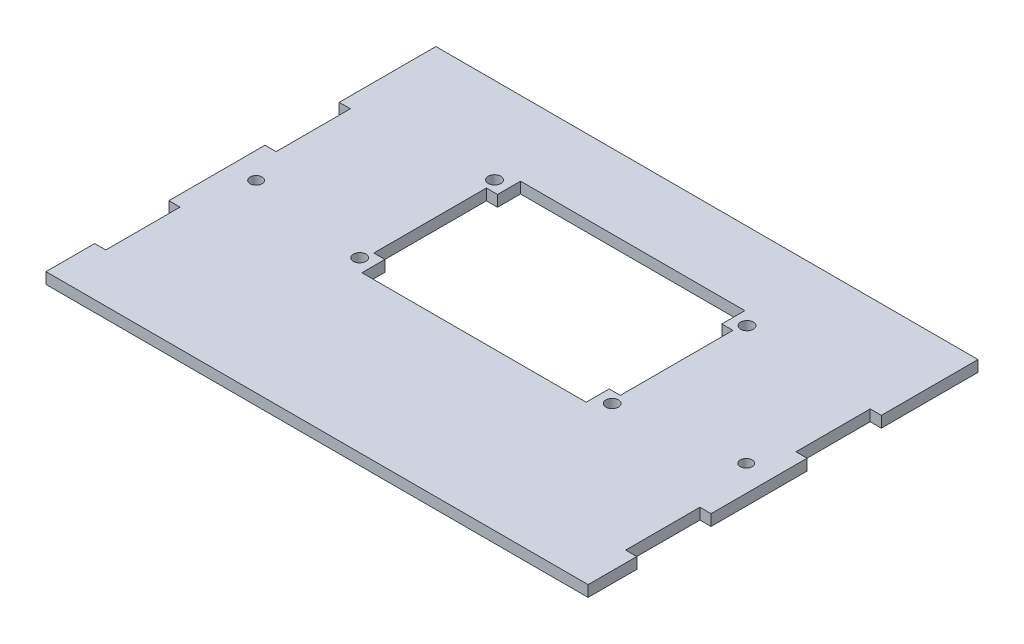
ISO-10303-21;
HEADER;
FILE_DESCRIPTION(('STEP AP214'),'2;1');
FILE_NAME('part.step','',(''),(''),'','','');
FILE_SCHEMA(('AUTOMOTIVE_DESIGN { 1 0 10303 214 1 1 1 1 }'));
ENDSEC;
DATA;
#1=APPLICATION_CONTEXT('core data for automotive mechanical design processes');
#2=APPLICATION_PROTOCOL_DEFINITION('international standard','automotive_design',2000,#1);
#3=PRODUCT_CONTEXT('',#1,'mechanical');
#4=PRODUCT('Part','Part','',(#3));
#5=PRODUCT_RELATED_PRODUCT_CATEGORY('part','',(#4));
#6=PRODUCT_DEFINITION_FORMATION('','',#4);
#7=PRODUCT_DEFINITION_CONTEXT('part definition',#1,'design');
#8=PRODUCT_DEFINITION('design','',#6,#7);
#9=PRODUCT_DEFINITION_SHAPE('','',#8);
#10=(LENGTH_UNIT() NAMED_UNIT(*) SI_UNIT(.MILLI.,.METRE.));
#11=(NAMED_UNIT(*) PLANE_ANGLE_UNIT() SI_UNIT($,.RADIAN.));
#12=(NAMED_UNIT(*) SI_UNIT($,.STERADIAN.) SOLID_ANGLE_UNIT());
#13=UNCERTAINTY_MEASURE_WITH_UNIT(LENGTH_MEASURE(1.E-05),#10,'distance_accuracy_value','');
#14=(GEOMETRIC_REPRESENTATION_CONTEXT(3) GLOBAL_UNCERTAINTY_ASSIGNED_CONTEXT((#13)) GLOBAL_UNIT_ASSIGNED_CONTEXT((#10,
#11,#12)) REPRESENTATION_CONTEXT('',''));
#15=CARTESIAN_POINT('',(0.,0.,0.));
#16=DIRECTION('',(0.,0.,1.));
#17=DIRECTION('',(1.,0.,0.));
#18=AXIS2_PLACEMENT_3D('',#15,#16,#17);
#19=CARTESIAN_POINT('',(-30.2,3.,10.22));
#20=DIRECTION('',(-1.,0.,0.));
#21=DIRECTION('',(0.,0.,1.));
#22=AXIS2_PLACEMENT_3D('',#19,#20,#21);
#23=PLANE('',#22);
#24=DIRECTION('',(0.,0.,-1.));
#25=VECTOR('',#24,1.);
#26=CARTESIAN_POINT('',(-30.2,3.,10.22));
#27=LINE('',#26,#25);
#28=CARTESIAN_POINT('',(-30.2,3.,-26.3));
#29=VERTEX_POINT('',#28);
#30=CARTESIAN_POINT('',(-30.2,3.,-32.5));
#31=VERTEX_POINT('',#30);
#32=EDGE_CURVE('E359',#29,#31,#27,.T.);
#33=ORIENTED_EDGE('',*,*,#32,.F.);
#34=DIRECTION('',(0.,-1.,0.));
#35=VECTOR('',#34,1.);
#36=CARTESIAN_POINT('',(-30.2,3.,-26.3));
#37=LINE('',#36,#35);
#38=CARTESIAN_POINT('',(-30.2,0.,-26.3));
#39=VERTEX_POINT('',#38);
#40=EDGE_CURVE('E303',#29,#39,#37,.T.);
#41=ORIENTED_EDGE('',*,*,#40,.T.);
#42=DIRECTION('',(0.,0.,-1.));
#43=VECTOR('',#42,1.);
#44=CARTESIAN_POINT('',(-30.2,0.,10.22));
#45=LINE('',#44,#43);
#46=CARTESIAN_POINT('',(-30.2,0.,-32.5));
#47=VERTEX_POINT('',#46);
#48=EDGE_CURVE('E375',#39,#47,#45,.T.);
#49=ORIENTED_EDGE('',*,*,#48,.T.);
#50=DIRECTION('',(0.,-1.,0.));
#51=VECTOR('',#50,1.);
#52=CARTESIAN_POINT('',(-30.2,3.,-32.5));
#53=LINE('',#52,#51);
#54=EDGE_CURVE('E307',#31,#47,#53,.T.);
#55=ORIENTED_EDGE('',*,*,#54,.F.);
#56=EDGE_LOOP('',(#33,#41,#49,#55));
#57=FACE_BOUND('',#56,.T.);
#58=ADVANCED_FACE('F51',(#57),#23,.F.);
#59=CARTESIAN_POINT('',(30.2,3.,-32.5));
#60=DIRECTION('',(1.,0.,0.));
#61=DIRECTION('',(0.,0.,-1.));
#62=AXIS2_PLACEMENT_3D('',#59,#60,#61);
#63=PLANE('',#62);
#64=DIRECTION('',(0.,0.,1.));
#65=VECTOR('',#64,1.);
#66=CARTESIAN_POINT('',(30.2,3.,-32.5));
#67=LINE('',#66,#65);
#68=CARTESIAN_POINT('',(30.2,3.,4.01999999999999));
#69=VERTEX_POINT('',#68);
#70=CARTESIAN_POINT('',(30.2,3.,10.22));
#71=VERTEX_POINT('',#70);
#72=EDGE_CURVE('E391',#69,#71,#67,.T.);
#73=ORIENTED_EDGE('',*,*,#72,.F.);
#74=DIRECTION('',(0.,-1.,0.));
#75=VECTOR('',#74,1.);
#76=CARTESIAN_POINT('',(30.2,3.,4.01999999999999));
#77=LINE('',#76,#75);
#78=CARTESIAN_POINT('',(30.2,0.,4.01999999999999));
#79=VERTEX_POINT('',#78);
#80=EDGE_CURVE('E322',#69,#79,#77,.T.);
#81=ORIENTED_EDGE('',*,*,#80,.T.);
#82=DIRECTION('',(0.,0.,1.));
#83=VECTOR('',#82,1.);
#84=CARTESIAN_POINT('',(30.2,0.,-32.5));
#85=LINE('',#84,#83);
#86=CARTESIAN_POINT('',(30.2,0.,10.22));
#87=VERTEX_POINT('',#86);
#88=EDGE_CURVE('E379',#79,#87,#85,.T.);
#89=ORIENTED_EDGE('',*,*,#88,.T.);
#90=DIRECTION('',(0.,-1.,0.));
#91=VECTOR('',#90,1.);
#92=CARTESIAN_POINT('',(30.2,3.,10.22));
#93=LINE('',#92,#91);
#94=EDGE_CURVE('E360',#71,#87,#93,.T.);
#95=ORIENTED_EDGE('',*,*,#94,.F.);
#96=EDGE_LOOP('',(#73,#81,#89,#95));
#97=FACE_BOUND('',#96,.T.);
#98=ADVANCED_FACE('F725',(#97),#63,.F.);
#99=CARTESIAN_POINT('',(-73.,3.,52.5));
#100=DIRECTION('',(1.,0.,0.));
#101=DIRECTION('',(0.,0.,-1.));
#102=AXIS2_PLACEMENT_3D('',#99,#100,#101);
#103=PLANE('',#102);
#104=DIRECTION('',(0.,0.,1.));
#105=VECTOR('',#104,1.);
#106=CARTESIAN_POINT('',(-73.,0.,52.5));
#107=LINE('',#106,#105);
#108=CARTESIAN_POINT('',(-73.,0.,-6.46999999999998));
#109=VERTEX_POINT('',#108);
#110=CARTESIAN_POINT('',(-73.,0.,19.4));
#111=VERTEX_POINT('',#110);
#112=EDGE_CURVE('E544',#109,#111,#107,.T.);
#113=ORIENTED_EDGE('',*,*,#112,.T.);
#114=DIRECTION('',(0.,1.,0.));
#115=VECTOR('',#114,1.);
#116=CARTESIAN_POINT('',(-73.,-7.,19.4));
#117=LINE('',#116,#115);
#118=CARTESIAN_POINT('',(-73.,3.,19.4));
#119=VERTEX_POINT('',#118);
#120=EDGE_CURVE('E474',#111,#119,#117,.T.);
#121=ORIENTED_EDGE('',*,*,#120,.T.);
#122=DIRECTION('',(0.,0.,1.));
#123=VECTOR('',#122,1.);
#124=CARTESIAN_POINT('',(-73.,3.,52.5));
#125=LINE('',#124,#123);
#126=CARTESIAN_POINT('',(-73.,3.,-6.46999999999998));
#127=VERTEX_POINT('',#126);
#128=EDGE_CURVE('E525',#127,#119,#125,.T.);
#129=ORIENTED_EDGE('',*,*,#128,.F.);
#130=DIRECTION('',(0.,1.,0.));
#131=VECTOR('',#130,1.);
#132=CARTESIAN_POINT('',(-73.,-7.,-6.46999999999998));
#133=LINE('',#132,#131);
#134=EDGE_CURVE('E514',#109,#127,#133,.T.);
#135=ORIENTED_EDGE('',*,*,#134,.F.);
#136=EDGE_LOOP('',(#113,#121,#129,#135));
#137=FACE_BOUND('',#136,.T.);
#138=ADVANCED_FACE('F628',(#137),#103,.F.);
#139=CARTESIAN_POINT('',(-73.,0.,-52.5));
#140=VERTEX_POINT('',#139);
#141=CARTESIAN_POINT('',(-73.,0.,-26.47));
#142=VERTEX_POINT('',#141);
#143=EDGE_CURVE('E539',#140,#142,#107,.T.);
#144=ORIENTED_EDGE('',*,*,#143,.T.);
#145=DIRECTION('',(0.,1.,0.));
#146=VECTOR('',#145,1.);
#147=CARTESIAN_POINT('',(-73.,-7.,-26.47));
#148=LINE('',#147,#146);
#149=CARTESIAN_POINT('',(-73.,3.,-26.47));
#150=VERTEX_POINT('',#149);
#151=EDGE_CURVE('E506',#142,#150,#148,.T.);
#152=ORIENTED_EDGE('',*,*,#151,.T.);
#153=CARTESIAN_POINT('',(-73.,3.,-52.5));
#154=VERTEX_POINT('',#153);
#155=EDGE_CURVE('E520',#154,#150,#125,.T.);
#156=ORIENTED_EDGE('',*,*,#155,.F.);
#157=DIRECTION('',(0.,-1.,0.));
#158=VECTOR('',#157,1.);
#159=CARTESIAN_POINT('',(-73.,3.,-52.5));
#160=LINE('',#159,#158);
#161=EDGE_CURVE('E538',#154,#140,#160,.T.);
#162=ORIENTED_EDGE('',*,*,#161,.T.);
#163=EDGE_LOOP('',(#144,#152,#156,#162));
#164=FACE_BOUND('',#163,.T.);
#165=ADVANCED_FACE('F687',(#164),#103,.F.);
#166=CARTESIAN_POINT('',(73.,3.,52.5));
#167=DIRECTION('',(-1.,0.,0.));
#168=DIRECTION('',(0.,0.,1.));
#169=AXIS2_PLACEMENT_3D('',#166,#167,#168);
#170=PLANE('',#169);
#171=DIRECTION('',(0.,0.,-1.));
#172=VECTOR('',#171,1.);
#173=CARTESIAN_POINT('',(73.,0.,52.5));
#174=LINE('',#173,#172);
#175=CARTESIAN_POINT('',(73.,0.,52.5));
#176=VERTEX_POINT('',#175);
#177=CARTESIAN_POINT('',(73.,0.,39.4));
#178=VERTEX_POINT('',#177);
#179=EDGE_CURVE('E548',#176,#178,#174,.T.);
#180=ORIENTED_EDGE('',*,*,#179,.T.);
#181=DIRECTION('',(0.,1.,0.));
#182=VECTOR('',#181,1.);
#183=CARTESIAN_POINT('',(73.,-7.,39.4));
#184=LINE('',#183,#182);
#185=CARTESIAN_POINT('',(73.,3.,39.4));
#186=VERTEX_POINT('',#185);
#187=EDGE_CURVE('E450',#178,#186,#184,.T.);
#188=ORIENTED_EDGE('',*,*,#187,.T.);
#189=DIRECTION('',(0.,0.,-1.));
#190=VECTOR('',#189,1.);
#191=CARTESIAN_POINT('',(73.,3.,52.5));
#192=LINE('',#191,#190);
#193=CARTESIAN_POINT('',(73.,3.,52.5));
#194=VERTEX_POINT('',#193);
#195=EDGE_CURVE('E530',#194,#186,#192,.T.);
#196=ORIENTED_EDGE('',*,*,#195,.F.);
#197=DIRECTION('',(0.,-1.,0.));
#198=VECTOR('',#197,1.);
#199=CARTESIAN_POINT('',(73.,3.,52.5));
#200=LINE('',#199,#198);
#201=EDGE_CURVE('E563',#194,#176,#200,.T.);
#202=ORIENTED_EDGE('',*,*,#201,.T.);
#203=EDGE_LOOP('',(#180,#188,#196,#202));
#204=FACE_BOUND('',#203,.T.);
#205=ADVANCED_FACE('F649',(#204),#170,.F.);
#206=CARTESIAN_POINT('',(73.,3.,19.4));
#207=VERTEX_POINT('',#206);
#208=CARTESIAN_POINT('',(73.,3.,-6.46999999999997));
#209=VERTEX_POINT('',#208);
#210=EDGE_CURVE('E535',#207,#209,#192,.T.);
#211=ORIENTED_EDGE('',*,*,#210,.F.);
#212=DIRECTION('',(0.,1.,0.));
#213=VECTOR('',#212,1.);
#214=CARTESIAN_POINT('',(73.,-7.,19.4));
#215=LINE('',#214,#213);
#216=CARTESIAN_POINT('',(73.,0.,19.4));
#217=VERTEX_POINT('',#216);
#218=EDGE_CURVE('E455',#217,#207,#215,.T.);
#219=ORIENTED_EDGE('',*,*,#218,.F.);
#220=CARTESIAN_POINT('',(73.,0.,-6.46999999999997));
#221=VERTEX_POINT('',#220);
#222=EDGE_CURVE('E553',#217,#221,#174,.T.);
#223=ORIENTED_EDGE('',*,*,#222,.T.);
#224=DIRECTION('',(0.,1.,0.));
#225=VECTOR('',#224,1.);
#226=CARTESIAN_POINT('',(73.,-7.,-6.46999999999997));
#227=LINE('',#226,#225);
#228=EDGE_CURVE('E424',#221,#209,#227,.T.);
#229=ORIENTED_EDGE('',*,*,#228,.T.);
#230=EDGE_LOOP('',(#211,#219,#223,#229));
#231=FACE_BOUND('',#230,.T.);
#232=ADVANCED_FACE('F666',(#231),#170,.F.);
#233=CARTESIAN_POINT('',(-73.,3.,39.4));
#234=VERTEX_POINT('',#233);
#235=CARTESIAN_POINT('',(-73.,3.,52.5));
#236=VERTEX_POINT('',#235);
#237=EDGE_CURVE('E526',#234,#236,#125,.T.);
#238=ORIENTED_EDGE('',*,*,#237,.F.);
#239=DIRECTION('',(0.,1.,0.));
#240=VECTOR('',#239,1.);
#241=CARTESIAN_POINT('',(-73.,-7.,39.4));
#242=LINE('',#241,#240);
#243=CARTESIAN_POINT('',(-73.,0.,39.4));
#244=VERTEX_POINT('',#243);
#245=EDGE_CURVE('E479',#244,#234,#242,.T.);
#246=ORIENTED_EDGE('',*,*,#245,.F.);
#247=CARTESIAN_POINT('',(-73.,0.,52.5));
#248=VERTEX_POINT('',#247);
#249=EDGE_CURVE('E510',#244,#248,#107,.T.);
#250=ORIENTED_EDGE('',*,*,#249,.T.);
#251=DIRECTION('',(0.,-1.,0.));
#252=VECTOR('',#251,1.);
#253=CARTESIAN_POINT('',(-73.,3.,52.5));
#254=LINE('',#253,#252);
#255=EDGE_CURVE('E567',#236,#248,#254,.T.);
#256=ORIENTED_EDGE('',*,*,#255,.F.);
#257=EDGE_LOOP('',(#238,#246,#250,#256));
#258=FACE_BOUND('',#257,.T.);
#259=ADVANCED_FACE('F53',(#258),#103,.F.);
#260=CARTESIAN_POINT('',(73.,3.,52.5));
#261=DIRECTION('',(0.,0.,-1.));
#262=DIRECTION('',(-1.,0.,0.));
#263=AXIS2_PLACEMENT_3D('',#260,#261,#262);
#264=PLANE('',#263);
#265=DIRECTION('',(1.,0.,0.));
#266=VECTOR('',#265,1.);
#267=CARTESIAN_POINT('',(73.,0.,52.5));
#268=LINE('',#267,#266);
#269=EDGE_CURVE('E543',#248,#176,#268,.T.);
#270=ORIENTED_EDGE('',*,*,#269,.T.);
#271=ORIENTED_EDGE('',*,*,#201,.F.);
#272=DIRECTION('',(1.,0.,0.));
#273=VECTOR('',#272,1.);
#274=CARTESIAN_POINT('',(73.,3.,52.5));
#275=LINE('',#274,#273);
#276=EDGE_CURVE('E524',#236,#194,#275,.T.);
#277=ORIENTED_EDGE('',*,*,#276,.F.);
#278=ORIENTED_EDGE('',*,*,#255,.T.);
#279=EDGE_LOOP('',(#270,#271,#277,#278));
#280=FACE_BOUND('',#279,.T.);
#281=ADVANCED_FACE('F643',(#280),#264,.F.);
#282=CARTESIAN_POINT('',(73.,3.,-26.47));
#283=VERTEX_POINT('',#282);
#284=CARTESIAN_POINT('',(73.,3.,-52.5));
#285=VERTEX_POINT('',#284);
#286=EDGE_CURVE('E529',#283,#285,#192,.T.);
#287=ORIENTED_EDGE('',*,*,#286,.F.);
#288=DIRECTION('',(0.,1.,0.));
#289=VECTOR('',#288,1.);
#290=CARTESIAN_POINT('',(73.,-7.,-26.47));
#291=LINE('',#290,#289);
#292=CARTESIAN_POINT('',(73.,0.,-26.47));
#293=VERTEX_POINT('',#292);
#294=EDGE_CURVE('E429',#293,#283,#291,.T.);
#295=ORIENTED_EDGE('',*,*,#294,.F.);
#296=CARTESIAN_POINT('',(73.,0.,-52.5));
#297=VERTEX_POINT('',#296);
#298=EDGE_CURVE('E547',#293,#297,#174,.T.);
#299=ORIENTED_EDGE('',*,*,#298,.T.);
#300=DIRECTION('',(0.,-1.,0.));
#301=VECTOR('',#300,1.);
#302=CARTESIAN_POINT('',(73.,3.,-52.5));
#303=LINE('',#302,#301);
#304=EDGE_CURVE('E559',#285,#297,#303,.T.);
#305=ORIENTED_EDGE('',*,*,#304,.F.);
#306=EDGE_LOOP('',(#287,#295,#299,#305));
#307=FACE_BOUND('',#306,.T.);
#308=ADVANCED_FACE('F679',(#307),#170,.F.);
#309=CARTESIAN_POINT('',(73.,3.,-52.5));
#310=DIRECTION('',(0.,0.,1.));
#311=DIRECTION('',(1.,0.,0.));
#312=AXIS2_PLACEMENT_3D('',#309,#310,#311);
#313=PLANE('',#312);
#314=DIRECTION('',(-1.,0.,0.));
#315=VECTOR('',#314,1.);
#316=CARTESIAN_POINT('',(73.,0.,-52.5));
#317=LINE('',#316,#315);
#318=EDGE_CURVE('E552',#297,#140,#317,.T.);
#319=ORIENTED_EDGE('',*,*,#318,.T.);
#320=ORIENTED_EDGE('',*,*,#161,.F.);
#321=DIRECTION('',(-1.,0.,0.));
#322=VECTOR('',#321,1.);
#323=CARTESIAN_POINT('',(73.,3.,-52.5));
#324=LINE('',#323,#322);
#325=EDGE_CURVE('E534',#285,#154,#324,.T.);
#326=ORIENTED_EDGE('',*,*,#325,.F.);
#327=ORIENTED_EDGE('',*,*,#304,.T.);
#328=EDGE_LOOP('',(#319,#320,#326,#327));
#329=FACE_BOUND('',#328,.T.);
#330=ADVANCED_FACE('F683',(#329),#313,.F.);
#331=CARTESIAN_POINT('',(0.,3.,0.));
#332=DIRECTION('',(0.,1.,0.));
#333=DIRECTION('',(0.,0.,1.));
#334=AXIS2_PLACEMENT_3D('',#331,#332,#333);
#335=PLANE('',#334);
#336=CARTESIAN_POINT('',(-66.,3.,2.92000000000003));
#337=DIRECTION('',(0.,1.,0.));
#338=DIRECTION('',(0.,0.,1.));
#339=AXIS2_PLACEMENT_3D('',#336,#337,#338);
#340=CIRCLE('',#339,1.60000000000001);
#341=CARTESIAN_POINT('',(-66.,3.,4.52000000000003));
#342=VERTEX_POINT('',#341);
#343=EDGE_CURVE('E293',#342,#342,#340,.T.);
#344=ORIENTED_EDGE('',*,*,#343,.F.);
#345=EDGE_LOOP('',(#344));
#346=FACE_BOUND('',#345,.T.);
#347=CARTESIAN_POINT('',(66.,3.,2.92000000000003));
#348=DIRECTION('',(0.,1.,0.));
#349=DIRECTION('',(0.,0.,1.));
#350=AXIS2_PLACEMENT_3D('',#347,#348,#349);
#351=CIRCLE('',#350,1.60000000000001);
#352=CARTESIAN_POINT('',(66.,3.,4.52000000000003));
#353=VERTEX_POINT('',#352);
#354=EDGE_CURVE('E1039',#353,#353,#351,.T.);
#355=ORIENTED_EDGE('',*,*,#354,.F.);
#356=EDGE_LOOP('',(#355));
#357=FACE_BOUND('',#356,.T.);
#358=DIRECTION('',(1.,0.,0.));
#359=VECTOR('',#358,1.);
#360=CARTESIAN_POINT('',(-33.2,3.,-26.3));
#361=LINE('',#360,#359);
#362=CARTESIAN_POINT('',(-33.2,3.,-26.3));
#363=VERTEX_POINT('',#362);
#364=EDGE_CURVE('E278',#363,#29,#361,.T.);
#365=ORIENTED_EDGE('',*,*,#364,.T.);
#366=ORIENTED_EDGE('',*,*,#32,.T.);
#367=DIRECTION('',(1.,0.,0.));
#368=VECTOR('',#367,1.);
#369=CARTESIAN_POINT('',(-30.2,3.,-32.5));
#370=LINE('',#369,#368);
#371=CARTESIAN_POINT('',(30.2,3.,-32.5));
#372=VERTEX_POINT('',#371);
#373=EDGE_CURVE('E396',#31,#372,#370,.T.);
#374=ORIENTED_EDGE('',*,*,#373,.T.);
#375=CARTESIAN_POINT('',(30.2,3.,-26.3));
#376=VERTEX_POINT('',#375);
#377=EDGE_CURVE('E392',#372,#376,#67,.T.);
#378=ORIENTED_EDGE('',*,*,#377,.T.);
#379=DIRECTION('',(1.,0.,0.));
#380=VECTOR('',#379,1.);
#381=CARTESIAN_POINT('',(33.2,3.,-26.3));
#382=LINE('',#381,#380);
#383=CARTESIAN_POINT('',(33.2,3.,-26.3));
#384=VERTEX_POINT('',#383);
#385=EDGE_CURVE('E75',#376,#384,#382,.T.);
#386=ORIENTED_EDGE('',*,*,#385,.T.);
#387=DIRECTION('',(0.,0.,1.));
#388=VECTOR('',#387,1.);
#389=CARTESIAN_POINT('',(33.2,3.,4.01999999999998));
#390=LINE('',#389,#388);
#391=CARTESIAN_POINT('',(33.2,3.,4.01999999999998));
#392=VERTEX_POINT('',#391);
#393=EDGE_CURVE('E339',#384,#392,#390,.T.);
#394=ORIENTED_EDGE('',*,*,#393,.T.);
#395=DIRECTION('',(-1.,0.,0.));
#396=VECTOR('',#395,1.);
#397=CARTESIAN_POINT('',(30.2,3.,4.01999999999999));
#398=LINE('',#397,#396);
#399=EDGE_CURVE('E315',#392,#69,#398,.T.);
#400=ORIENTED_EDGE('',*,*,#399,.T.);
#401=ORIENTED_EDGE('',*,*,#72,.T.);
#402=DIRECTION('',(-1.,0.,0.));
#403=VECTOR('',#402,1.);
#404=CARTESIAN_POINT('',(30.2,3.,10.22));
#405=LINE('',#404,#403);
#406=CARTESIAN_POINT('',(-30.2,3.,10.22));
#407=VERTEX_POINT('',#406);
#408=EDGE_CURVE('E388',#71,#407,#405,.T.);
#409=ORIENTED_EDGE('',*,*,#408,.T.);
#410=CARTESIAN_POINT('',(-30.2,3.,4.02));
#411=VERTEX_POINT('',#410);
#412=EDGE_CURVE('E285',#407,#411,#27,.T.);
#413=ORIENTED_EDGE('',*,*,#412,.T.);
#414=DIRECTION('',(-1.,0.,0.));
#415=VECTOR('',#414,1.);
#416=CARTESIAN_POINT('',(-30.2,3.,4.02));
#417=LINE('',#416,#415);
#418=CARTESIAN_POINT('',(-33.2,3.,4.02));
#419=VERTEX_POINT('',#418);
#420=EDGE_CURVE('E67',#411,#419,#417,.T.);
#421=ORIENTED_EDGE('',*,*,#420,.T.);
#422=DIRECTION('',(0.,0.,-1.));
#423=VECTOR('',#422,1.);
#424=CARTESIAN_POINT('',(-33.2,3.,4.02));
#425=LINE('',#424,#423);
#426=EDGE_CURVE('E272',#419,#363,#425,.T.);
#427=ORIENTED_EDGE('',*,*,#426,.T.);
#428=EDGE_LOOP('',(#365,#366,#374,#378,#386,#394,#400,#401,#409,#413,#421,#427));
#429=FACE_BOUND('',#428,.T.);
#430=CARTESIAN_POINT('',(34.,3.,7.02));
#431=DIRECTION('',(0.,-1.,0.));
#432=DIRECTION('',(0.,0.,-1.));
#433=AXIS2_PLACEMENT_3D('',#430,#431,#432);
#434=CIRCLE('',#433,1.7);
#435=CARTESIAN_POINT('',(34.,3.,5.32));
#436=VERTEX_POINT('',#435);
#437=EDGE_CURVE('E405',#436,#436,#434,.T.);
#438=ORIENTED_EDGE('',*,*,#437,.T.);
#439=EDGE_LOOP('',(#438));
#440=FACE_BOUND('',#439,.T.);
#441=CARTESIAN_POINT('',(-34.,3.,-29.3));
#442=DIRECTION('',(0.,-1.,0.));
#443=DIRECTION('',(0.,0.,-1.));
#444=AXIS2_PLACEMENT_3D('',#441,#442,#443);
#445=CIRCLE('',#444,1.7);
#446=CARTESIAN_POINT('',(-34.,3.,-31.));
#447=VERTEX_POINT('',#446);
#448=EDGE_CURVE('E349',#447,#447,#445,.T.);
#449=ORIENTED_EDGE('',*,*,#448,.T.);
#450=EDGE_LOOP('',(#449));
#451=FACE_BOUND('',#450,.T.);
#452=CARTESIAN_POINT('',(-34.,3.,7.02));
#453=DIRECTION('',(0.,-1.,0.));
#454=DIRECTION('',(0.,0.,-1.));
#455=AXIS2_PLACEMENT_3D('',#452,#453,#454);
#456=CIRCLE('',#455,1.7);
#457=CARTESIAN_POINT('',(-34.,3.,5.32));
#458=VERTEX_POINT('',#457);
#459=EDGE_CURVE('E350',#458,#458,#456,.T.);
#460=ORIENTED_EDGE('',*,*,#459,.T.);
#461=EDGE_LOOP('',(#460));
#462=FACE_BOUND('',#461,.T.);
#463=CARTESIAN_POINT('',(34.,3.,-29.3));
#464=DIRECTION('',(0.,-1.,0.));
#465=DIRECTION('',(0.,0.,-1.));
#466=AXIS2_PLACEMENT_3D('',#463,#464,#465);
#467=CIRCLE('',#466,1.7);
#468=CARTESIAN_POINT('',(34.,3.,-31.));
#469=VERTEX_POINT('',#468);
#470=EDGE_CURVE('E416',#469,#469,#467,.T.);
#471=ORIENTED_EDGE('',*,*,#470,.T.);
#472=EDGE_LOOP('',(#471));
#473=FACE_BOUND('',#472,.T.);
#474=DIRECTION('',(-1.,0.,0.));
#475=VECTOR('',#474,1.);
#476=CARTESIAN_POINT('',(-70.,3.,19.4));
#477=LINE('',#476,#475);
#478=CARTESIAN_POINT('',(-70.,3.,19.4));
#479=VERTEX_POINT('',#478);
#480=EDGE_CURVE('E464',#479,#119,#477,.T.);
#481=ORIENTED_EDGE('',*,*,#480,.F.);
#482=DIRECTION('',(0.,0.,-1.));
#483=VECTOR('',#482,1.);
#484=CARTESIAN_POINT('',(-70.,3.,39.4));
#485=LINE('',#484,#483);
#486=CARTESIAN_POINT('',(-70.,3.,39.4));
#487=VERTEX_POINT('',#486);
#488=EDGE_CURVE('E478',#487,#479,#485,.T.);
#489=ORIENTED_EDGE('',*,*,#488,.F.);
#490=DIRECTION('',(1.,0.,0.));
#491=VECTOR('',#490,1.);
#492=CARTESIAN_POINT('',(-73.,3.,39.4));
#493=LINE('',#492,#491);
#494=EDGE_CURVE('E490',#234,#487,#493,.T.);
#495=ORIENTED_EDGE('',*,*,#494,.F.);
#496=ORIENTED_EDGE('',*,*,#237,.T.);
#497=ORIENTED_EDGE('',*,*,#276,.T.);
#498=ORIENTED_EDGE('',*,*,#195,.T.);
#499=DIRECTION('',(1.,0.,0.));
#500=VECTOR('',#499,1.);
#501=CARTESIAN_POINT('',(73.,3.,39.4));
#502=LINE('',#501,#500);
#503=CARTESIAN_POINT('',(70.,3.,39.4));
#504=VERTEX_POINT('',#503);
#505=EDGE_CURVE('E438',#504,#186,#502,.T.);
#506=ORIENTED_EDGE('',*,*,#505,.F.);
#507=DIRECTION('',(0.,0.,1.));
#508=VECTOR('',#507,1.);
#509=CARTESIAN_POINT('',(70.,3.,39.4));
#510=LINE('',#509,#508);
#511=CARTESIAN_POINT('',(70.,3.,19.4));
#512=VERTEX_POINT('',#511);
#513=EDGE_CURVE('E454',#512,#504,#510,.T.);
#514=ORIENTED_EDGE('',*,*,#513,.F.);
#515=DIRECTION('',(-1.,0.,0.));
#516=VECTOR('',#515,1.);
#517=CARTESIAN_POINT('',(70.,3.,19.4));
#518=LINE('',#517,#516);
#519=EDGE_CURVE('E468',#207,#512,#518,.T.);
#520=ORIENTED_EDGE('',*,*,#519,.F.);
#521=ORIENTED_EDGE('',*,*,#210,.T.);
#522=DIRECTION('',(1.,0.,0.));
#523=VECTOR('',#522,1.);
#524=CARTESIAN_POINT('',(73.,3.,-6.46999999999997));
#525=LINE('',#524,#523);
#526=CARTESIAN_POINT('',(70.,3.,-6.46999999999998));
#527=VERTEX_POINT('',#526);
#528=EDGE_CURVE('E446',#527,#209,#525,.T.);
#529=ORIENTED_EDGE('',*,*,#528,.F.);
#530=DIRECTION('',(0.,0.,1.));
#531=VECTOR('',#530,1.);
#532=CARTESIAN_POINT('',(70.,3.,-6.46999999999998));
#533=LINE('',#532,#531);
#534=CARTESIAN_POINT('',(70.,3.,-26.47));
#535=VERTEX_POINT('',#534);
#536=EDGE_CURVE('E428',#535,#527,#533,.T.);
#537=ORIENTED_EDGE('',*,*,#536,.F.);
#538=DIRECTION('',(-1.,0.,0.));
#539=VECTOR('',#538,1.);
#540=CARTESIAN_POINT('',(70.,3.,-26.47));
#541=LINE('',#540,#539);
#542=EDGE_CURVE('E442',#283,#535,#541,.T.);
#543=ORIENTED_EDGE('',*,*,#542,.F.);
#544=ORIENTED_EDGE('',*,*,#286,.T.);
#545=ORIENTED_EDGE('',*,*,#325,.T.);
#546=ORIENTED_EDGE('',*,*,#155,.T.);
#547=DIRECTION('',(-1.,0.,0.));
#548=VECTOR('',#547,1.);
#549=CARTESIAN_POINT('',(-70.,3.,-26.47));
#550=LINE('',#549,#548);
#551=CARTESIAN_POINT('',(-70.,3.,-26.47));
#552=VERTEX_POINT('',#551);
#553=EDGE_CURVE('E449',#552,#150,#550,.T.);
#554=ORIENTED_EDGE('',*,*,#553,.F.);
#555=DIRECTION('',(0.,0.,-1.));
#556=VECTOR('',#555,1.);
#557=CARTESIAN_POINT('',(-70.,3.,-26.47));
#558=LINE('',#557,#556);
#559=CARTESIAN_POINT('',(-70.,3.,-6.46999999999998));
#560=VERTEX_POINT('',#559);
#561=EDGE_CURVE('E502',#560,#552,#558,.T.);
#562=ORIENTED_EDGE('',*,*,#561,.F.);
#563=DIRECTION('',(1.,0.,0.));
#564=VECTOR('',#563,1.);
#565=CARTESIAN_POINT('',(-73.,3.,-6.46999999999998));
#566=LINE('',#565,#564);
#567=EDGE_CURVE('E498',#127,#560,#566,.T.);
#568=ORIENTED_EDGE('',*,*,#567,.F.);
#569=ORIENTED_EDGE('',*,*,#128,.T.);
#570=EDGE_LOOP('',(#481,#489,#495,#496,#497,#498,#506,#514,#520,#521,#529,#537,#543,#544,#545,
#546,#554,#562,#568,#569));
#571=FACE_BOUND('',#570,.T.);
#572=ADVANCED_FACE('F281',(#346,#357,#429,#440,#451,#462,#473,#571),#335,.T.);
#573=CARTESIAN_POINT('',(0.,0.,0.));
#574=DIRECTION('',(0.,1.,0.));
#575=DIRECTION('',(0.,0.,1.));
#576=AXIS2_PLACEMENT_3D('',#573,#574,#575);
#577=PLANE('',#576);
#578=CARTESIAN_POINT('',(-66.,0.,2.92000000000003));
#579=DIRECTION('',(0.,-1.,0.));
#580=DIRECTION('',(0.,0.,-1.));
#581=AXIS2_PLACEMENT_3D('',#578,#579,#580);
#582=CIRCLE('',#581,1.60000000000001);
#583=CARTESIAN_POINT('',(-66.,0.,1.32000000000002));
#584=VERTEX_POINT('',#583);
#585=EDGE_CURVE('E1037',#584,#584,#582,.T.);
#586=ORIENTED_EDGE('',*,*,#585,.F.);
#587=EDGE_LOOP('',(#586));
#588=FACE_BOUND('',#587,.T.);
#589=CARTESIAN_POINT('',(66.,0.,2.92000000000003));
#590=DIRECTION('',(0.,-1.,0.));
#591=DIRECTION('',(0.,0.,-1.));
#592=AXIS2_PLACEMENT_3D('',#589,#590,#591);
#593=CIRCLE('',#592,1.60000000000001);
#594=CARTESIAN_POINT('',(66.,0.,1.32000000000002));
#595=VERTEX_POINT('',#594);
#596=EDGE_CURVE('E1040',#595,#595,#593,.T.);
#597=ORIENTED_EDGE('',*,*,#596,.F.);
#598=EDGE_LOOP('',(#597));
#599=FACE_BOUND('',#598,.T.);
#600=CARTESIAN_POINT('',(34.,0.,7.02));
#601=DIRECTION('',(0.,-1.,0.));
#602=DIRECTION('',(0.,0.,-1.));
#603=AXIS2_PLACEMENT_3D('',#600,#601,#602);
#604=CIRCLE('',#603,1.7);
#605=CARTESIAN_POINT('',(34.,0.,5.32));
#606=VERTEX_POINT('',#605);
#607=EDGE_CURVE('E400',#606,#606,#604,.T.);
#608=ORIENTED_EDGE('',*,*,#607,.F.);
#609=EDGE_LOOP('',(#608));
#610=FACE_BOUND('',#609,.T.);
#611=CARTESIAN_POINT('',(-34.,0.,-29.3));
#612=DIRECTION('',(0.,-1.,0.));
#613=DIRECTION('',(0.,0.,-1.));
#614=AXIS2_PLACEMENT_3D('',#611,#612,#613);
#615=CIRCLE('',#614,1.7);
#616=CARTESIAN_POINT('',(-34.,0.,-31.));
#617=VERTEX_POINT('',#616);
#618=EDGE_CURVE('E409',#617,#617,#615,.T.);
#619=ORIENTED_EDGE('',*,*,#618,.F.);
#620=EDGE_LOOP('',(#619));
#621=FACE_BOUND('',#620,.T.);
#622=CARTESIAN_POINT('',(-34.,0.,7.02));
#623=DIRECTION('',(0.,-1.,0.));
#624=DIRECTION('',(0.,0.,-1.));
#625=AXIS2_PLACEMENT_3D('',#622,#623,#624);
#626=CIRCLE('',#625,1.7);
#627=CARTESIAN_POINT('',(-34.,0.,5.32));
#628=VERTEX_POINT('',#627);
#629=EDGE_CURVE('E345',#628,#628,#626,.T.);
#630=ORIENTED_EDGE('',*,*,#629,.F.);
#631=EDGE_LOOP('',(#630));
#632=FACE_BOUND('',#631,.T.);
#633=ORIENTED_EDGE('',*,*,#48,.F.);
#634=DIRECTION('',(1.,0.,0.));
#635=VECTOR('',#634,1.);
#636=CARTESIAN_POINT('',(-33.2,0.,-26.3));
#637=LINE('',#636,#635);
#638=CARTESIAN_POINT('',(-33.2,0.,-26.3));
#639=VERTEX_POINT('',#638);
#640=EDGE_CURVE('E287',#639,#39,#637,.T.);
#641=ORIENTED_EDGE('',*,*,#640,.F.);
#642=DIRECTION('',(0.,0.,-1.));
#643=VECTOR('',#642,1.);
#644=CARTESIAN_POINT('',(-33.2,0.,4.02));
#645=LINE('',#644,#643);
#646=CARTESIAN_POINT('',(-33.2,0.,4.02));
#647=VERTEX_POINT('',#646);
#648=EDGE_CURVE('E290',#647,#639,#645,.T.);
#649=ORIENTED_EDGE('',*,*,#648,.F.);
#650=DIRECTION('',(-1.,0.,0.));
#651=VECTOR('',#650,1.);
#652=CARTESIAN_POINT('',(-30.2,0.,4.02));
#653=LINE('',#652,#651);
#654=CARTESIAN_POINT('',(-30.2,0.,4.02));
#655=VERTEX_POINT('',#654);
#656=EDGE_CURVE('E263',#655,#647,#653,.T.);
#657=ORIENTED_EDGE('',*,*,#656,.F.);
#658=CARTESIAN_POINT('',(-30.2,0.,10.22));
#659=VERTEX_POINT('',#658);
#660=EDGE_CURVE('E370',#659,#655,#45,.T.);
#661=ORIENTED_EDGE('',*,*,#660,.F.);
#662=DIRECTION('',(-1.,0.,0.));
#663=VECTOR('',#662,1.);
#664=CARTESIAN_POINT('',(30.2,0.,10.22));
#665=LINE('',#664,#663);
#666=EDGE_CURVE('E374',#87,#659,#665,.T.);
#667=ORIENTED_EDGE('',*,*,#666,.F.);
#668=ORIENTED_EDGE('',*,*,#88,.F.);
#669=DIRECTION('',(-1.,0.,0.));
#670=VECTOR('',#669,1.);
#671=CARTESIAN_POINT('',(30.2,0.,4.01999999999999));
#672=LINE('',#671,#670);
#673=CARTESIAN_POINT('',(33.2,0.,4.01999999999998));
#674=VERTEX_POINT('',#673);
#675=EDGE_CURVE('E326',#674,#79,#672,.T.);
#676=ORIENTED_EDGE('',*,*,#675,.F.);
#677=DIRECTION('',(0.,0.,1.));
#678=VECTOR('',#677,1.);
#679=CARTESIAN_POINT('',(33.2,0.,4.01999999999998));
#680=LINE('',#679,#678);
#681=CARTESIAN_POINT('',(33.2,0.,-26.3));
#682=VERTEX_POINT('',#681);
#683=EDGE_CURVE('E329',#682,#674,#680,.T.);
#684=ORIENTED_EDGE('',*,*,#683,.F.);
#685=DIRECTION('',(1.,0.,0.));
#686=VECTOR('',#685,1.);
#687=CARTESIAN_POINT('',(33.2,0.,-26.3));
#688=LINE('',#687,#686);
#689=CARTESIAN_POINT('',(30.2,0.,-26.3));
#690=VERTEX_POINT('',#689);
#691=EDGE_CURVE('E300',#690,#682,#688,.T.);
#692=ORIENTED_EDGE('',*,*,#691,.F.);
#693=CARTESIAN_POINT('',(30.2,0.,-32.5));
#694=VERTEX_POINT('',#693);
#695=EDGE_CURVE('E380',#694,#690,#85,.T.);
#696=ORIENTED_EDGE('',*,*,#695,.F.);
#697=DIRECTION('',(1.,0.,0.));
#698=VECTOR('',#697,1.);
#699=CARTESIAN_POINT('',(-30.2,0.,-32.5));
#700=LINE('',#699,#698);
#701=EDGE_CURVE('E354',#47,#694,#700,.T.);
#702=ORIENTED_EDGE('',*,*,#701,.F.);
#703=EDGE_LOOP('',(#633,#641,#649,#657,#661,#667,#668,#676,#684,#692,#696,#702));
#704=FACE_BOUND('',#703,.T.);
#705=CARTESIAN_POINT('',(34.,0.,-29.3));
#706=DIRECTION('',(0.,-1.,0.));
#707=DIRECTION('',(0.,0.,-1.));
#708=AXIS2_PLACEMENT_3D('',#705,#706,#707);
#709=CIRCLE('',#708,1.7);
#710=CARTESIAN_POINT('',(34.,0.,-31.));
#711=VERTEX_POINT('',#710);
#712=EDGE_CURVE('E404',#711,#711,#709,.T.);
#713=ORIENTED_EDGE('',*,*,#712,.F.);
#714=EDGE_LOOP('',(#713));
#715=FACE_BOUND('',#714,.T.);
#716=DIRECTION('',(0.,0.,-1.));
#717=VECTOR('',#716,1.);
#718=CARTESIAN_POINT('',(-70.,0.,0.));
#719=LINE('',#718,#717);
#720=CARTESIAN_POINT('',(-70.,0.,39.4));
#721=VERTEX_POINT('',#720);
#722=CARTESIAN_POINT('',(-70.,0.,19.4));
#723=VERTEX_POINT('',#722);
#724=EDGE_CURVE('E60',#721,#723,#719,.T.);
#725=ORIENTED_EDGE('',*,*,#724,.T.);
#726=DIRECTION('',(-1.,0.,0.));
#727=VECTOR('',#726,1.);
#728=CARTESIAN_POINT('',(0.,0.,19.4));
#729=LINE('',#728,#727);
#730=EDGE_CURVE('E11',#723,#111,#729,.T.);
#731=ORIENTED_EDGE('',*,*,#730,.T.);
#732=ORIENTED_EDGE('',*,*,#112,.F.);
#733=DIRECTION('',(1.,0.,0.));
#734=VECTOR('',#733,1.);
#735=CARTESIAN_POINT('',(0.,0.,-6.46999999999998));
#736=LINE('',#735,#734);
#737=CARTESIAN_POINT('',(-70.,0.,-6.46999999999998));
#738=VERTEX_POINT('',#737);
#739=EDGE_CURVE('E571',#109,#738,#736,.T.);
#740=ORIENTED_EDGE('',*,*,#739,.T.);
#741=DIRECTION('',(0.,0.,-1.));
#742=VECTOR('',#741,1.);
#743=CARTESIAN_POINT('',(-70.,0.,0.));
#744=LINE('',#743,#742);
#745=CARTESIAN_POINT('',(-70.,0.,-26.47));
#746=VERTEX_POINT('',#745);
#747=EDGE_CURVE('E575',#738,#746,#744,.T.);
#748=ORIENTED_EDGE('',*,*,#747,.T.);
#749=DIRECTION('',(-1.,0.,0.));
#750=VECTOR('',#749,1.);
#751=CARTESIAN_POINT('',(0.,0.,-26.4700000000001));
#752=LINE('',#751,#750);
#753=EDGE_CURVE('E579',#746,#142,#752,.T.);
#754=ORIENTED_EDGE('',*,*,#753,.T.);
#755=ORIENTED_EDGE('',*,*,#143,.F.);
#756=ORIENTED_EDGE('',*,*,#318,.F.);
#757=ORIENTED_EDGE('',*,*,#298,.F.);
#758=DIRECTION('',(-1.,0.,0.));
#759=VECTOR('',#758,1.);
#760=CARTESIAN_POINT('',(0.,0.,-26.4700000000001));
#761=LINE('',#760,#759);
#762=CARTESIAN_POINT('',(70.,0.,-26.47));
#763=VERTEX_POINT('',#762);
#764=EDGE_CURVE('E583',#293,#763,#761,.T.);
#765=ORIENTED_EDGE('',*,*,#764,.T.);
#766=DIRECTION('',(0.,0.,1.));
#767=VECTOR('',#766,1.);
#768=CARTESIAN_POINT('',(70.,0.,0.));
#769=LINE('',#768,#767);
#770=CARTESIAN_POINT('',(70.,0.,-6.46999999999998));
#771=VERTEX_POINT('',#770);
#772=EDGE_CURVE('E587',#763,#771,#769,.T.);
#773=ORIENTED_EDGE('',*,*,#772,.T.);
#774=DIRECTION('',(1.,0.,0.));
#775=VECTOR('',#774,1.);
#776=CARTESIAN_POINT('',(0.,0.,-6.47));
#777=LINE('',#776,#775);
#778=EDGE_CURVE('E591',#771,#221,#777,.T.);
#779=ORIENTED_EDGE('',*,*,#778,.T.);
#780=ORIENTED_EDGE('',*,*,#222,.F.);
#781=DIRECTION('',(-1.,0.,0.));
#782=VECTOR('',#781,1.);
#783=CARTESIAN_POINT('',(0.,0.,19.4));
#784=LINE('',#783,#782);
#785=CARTESIAN_POINT('',(70.,0.,19.4));
#786=VERTEX_POINT('',#785);
#787=EDGE_CURVE('E595',#217,#786,#784,.T.);
#788=ORIENTED_EDGE('',*,*,#787,.T.);
#789=DIRECTION('',(0.,0.,1.));
#790=VECTOR('',#789,1.);
#791=CARTESIAN_POINT('',(70.,0.,0.));
#792=LINE('',#791,#790);
#793=CARTESIAN_POINT('',(70.,0.,39.4));
#794=VERTEX_POINT('',#793);
#795=EDGE_CURVE('E599',#786,#794,#792,.T.);
#796=ORIENTED_EDGE('',*,*,#795,.T.);
#797=DIRECTION('',(1.,0.,0.));
#798=VECTOR('',#797,1.);
#799=CARTESIAN_POINT('',(0.,0.,39.4));
#800=LINE('',#799,#798);
#801=EDGE_CURVE('E603',#794,#178,#800,.T.);
#802=ORIENTED_EDGE('',*,*,#801,.T.);
#803=ORIENTED_EDGE('',*,*,#179,.F.);
#804=ORIENTED_EDGE('',*,*,#269,.F.);
#805=ORIENTED_EDGE('',*,*,#249,.F.);
#806=DIRECTION('',(1.,0.,0.));
#807=VECTOR('',#806,1.);
#808=CARTESIAN_POINT('',(0.,0.,39.4));
#809=LINE('',#808,#807);
#810=EDGE_CURVE('E607',#244,#721,#809,.T.);
#811=ORIENTED_EDGE('',*,*,#810,.T.);
#812=EDGE_LOOP('',(#725,#731,#732,#740,#748,#754,#755,#756,#757,#765,#773,#779,#780,#788,#796,
#802,#803,#804,#805,#811));
#813=FACE_BOUND('',#812,.T.);
#814=ADVANCED_FACE('F614',(#588,#599,#610,#621,#632,#704,#715,#813),#577,.F.);
#815=CARTESIAN_POINT('',(-70.,-7.,-26.47));
#816=DIRECTION('',(0.,0.,-1.));
#817=DIRECTION('',(-1.,0.,0.));
#818=AXIS2_PLACEMENT_3D('',#815,#816,#817);
#819=PLANE('',#818);
#820=DIRECTION('',(0.,1.,0.));
#821=VECTOR('',#820,1.);
#822=CARTESIAN_POINT('',(-70.,-7.,-26.47));
#823=LINE('',#822,#821);
#824=EDGE_CURVE('E507',#746,#552,#823,.T.);
#825=ORIENTED_EDGE('',*,*,#824,.T.);
#826=ORIENTED_EDGE('',*,*,#553,.T.);
#827=ORIENTED_EDGE('',*,*,#151,.F.);
#828=ORIENTED_EDGE('',*,*,#753,.F.);
#829=EDGE_LOOP('',(#825,#826,#827,#828));
#830=FACE_BOUND('',#829,.T.);
#831=ADVANCED_FACE('F690',(#830),#819,.F.);
#832=CARTESIAN_POINT('',(-70.,-7.,-26.47));
#833=DIRECTION('',(1.,0.,0.));
#834=DIRECTION('',(0.,0.,-1.));
#835=AXIS2_PLACEMENT_3D('',#832,#833,#834);
#836=PLANE('',#835);
#837=DIRECTION('',(0.,1.,0.));
#838=VECTOR('',#837,1.);
#839=CARTESIAN_POINT('',(-70.,-7.,-6.46999999999998));
#840=LINE('',#839,#838);
#841=EDGE_CURVE('E511',#738,#560,#840,.T.);
#842=ORIENTED_EDGE('',*,*,#841,.T.);
#843=ORIENTED_EDGE('',*,*,#561,.T.);
#844=ORIENTED_EDGE('',*,*,#824,.F.);
#845=ORIENTED_EDGE('',*,*,#747,.F.);
#846=EDGE_LOOP('',(#842,#843,#844,#845));
#847=FACE_BOUND('',#846,.T.);
#848=ADVANCED_FACE('F694',(#847),#836,.F.);
#849=CARTESIAN_POINT('',(-73.,-7.,-6.46999999999998));
#850=DIRECTION('',(0.,0.,1.));
#851=DIRECTION('',(1.,0.,0.));
#852=AXIS2_PLACEMENT_3D('',#849,#850,#851);
#853=PLANE('',#852);
#854=ORIENTED_EDGE('',*,*,#134,.T.);
#855=ORIENTED_EDGE('',*,*,#567,.T.);
#856=ORIENTED_EDGE('',*,*,#841,.F.);
#857=ORIENTED_EDGE('',*,*,#739,.F.);
#858=EDGE_LOOP('',(#854,#855,#856,#857));
#859=FACE_BOUND('',#858,.T.);
#860=ADVANCED_FACE('F696',(#859),#853,.F.);
#861=CARTESIAN_POINT('',(73.,-7.,-6.46999999999997));
#862=DIRECTION('',(0.,0.,1.));
#863=DIRECTION('',(1.,0.,0.));
#864=AXIS2_PLACEMENT_3D('',#861,#862,#863);
#865=PLANE('',#864);
#866=DIRECTION('',(0.,1.,0.));
#867=VECTOR('',#866,1.);
#868=CARTESIAN_POINT('',(70.,-7.,-6.46999999999998));
#869=LINE('',#868,#867);
#870=EDGE_CURVE('E435',#771,#527,#869,.T.);
#871=ORIENTED_EDGE('',*,*,#870,.T.);
#872=ORIENTED_EDGE('',*,*,#528,.T.);
#873=ORIENTED_EDGE('',*,*,#228,.F.);
#874=ORIENTED_EDGE('',*,*,#778,.F.);
#875=EDGE_LOOP('',(#871,#872,#873,#874));
#876=FACE_BOUND('',#875,.T.);
#877=ADVANCED_FACE('F863',(#876),#865,.F.);
#878=CARTESIAN_POINT('',(70.,-7.,-6.46999999999998));
#879=DIRECTION('',(-1.,0.,0.));
#880=DIRECTION('',(0.,0.,1.));
#881=AXIS2_PLACEMENT_3D('',#878,#879,#880);
#882=PLANE('',#881);
#883=DIRECTION('',(0.,1.,0.));
#884=VECTOR('',#883,1.);
#885=CARTESIAN_POINT('',(70.,-7.,-26.47));
#886=LINE('',#885,#884);
#887=EDGE_CURVE('E432',#763,#535,#886,.T.);
#888=ORIENTED_EDGE('',*,*,#887,.T.);
#889=ORIENTED_EDGE('',*,*,#536,.T.);
#890=ORIENTED_EDGE('',*,*,#870,.F.);
#891=ORIENTED_EDGE('',*,*,#772,.F.);
#892=EDGE_LOOP('',(#888,#889,#890,#891));
#893=FACE_BOUND('',#892,.T.);
#894=ADVANCED_FACE('F871',(#893),#882,.F.);
#895=CARTESIAN_POINT('',(70.,-7.,-26.47));
#896=DIRECTION('',(0.,0.,-1.));
#897=DIRECTION('',(-1.,0.,0.));
#898=AXIS2_PLACEMENT_3D('',#895,#896,#897);
#899=PLANE('',#898);
#900=ORIENTED_EDGE('',*,*,#294,.T.);
#901=ORIENTED_EDGE('',*,*,#542,.T.);
#902=ORIENTED_EDGE('',*,*,#887,.F.);
#903=ORIENTED_EDGE('',*,*,#764,.F.);
#904=EDGE_LOOP('',(#900,#901,#902,#903));
#905=FACE_BOUND('',#904,.T.);
#906=ADVANCED_FACE('F880',(#905),#899,.F.);
#907=CARTESIAN_POINT('',(73.,-7.,39.4));
#908=DIRECTION('',(0.,0.,1.));
#909=DIRECTION('',(1.,0.,0.));
#910=AXIS2_PLACEMENT_3D('',#907,#908,#909);
#911=PLANE('',#910);
#912=DIRECTION('',(0.,1.,0.));
#913=VECTOR('',#912,1.);
#914=CARTESIAN_POINT('',(70.,-7.,39.4));
#915=LINE('',#914,#913);
#916=EDGE_CURVE('E461',#794,#504,#915,.T.);
#917=ORIENTED_EDGE('',*,*,#916,.T.);
#918=ORIENTED_EDGE('',*,*,#505,.T.);
#919=ORIENTED_EDGE('',*,*,#187,.F.);
#920=ORIENTED_EDGE('',*,*,#801,.F.);
#921=EDGE_LOOP('',(#917,#918,#919,#920));
#922=FACE_BOUND('',#921,.T.);
#923=ADVANCED_FACE('F654',(#922),#911,.F.);
#924=CARTESIAN_POINT('',(70.,-7.,39.4));
#925=DIRECTION('',(-1.,0.,0.));
#926=DIRECTION('',(0.,0.,1.));
#927=AXIS2_PLACEMENT_3D('',#924,#925,#926);
#928=PLANE('',#927);
#929=DIRECTION('',(0.,1.,0.));
#930=VECTOR('',#929,1.);
#931=CARTESIAN_POINT('',(70.,-7.,19.4));
#932=LINE('',#931,#930);
#933=EDGE_CURVE('E458',#786,#512,#932,.T.);
#934=ORIENTED_EDGE('',*,*,#933,.T.);
#935=ORIENTED_EDGE('',*,*,#513,.T.);
#936=ORIENTED_EDGE('',*,*,#916,.F.);
#937=ORIENTED_EDGE('',*,*,#795,.F.);
#938=EDGE_LOOP('',(#934,#935,#936,#937));
#939=FACE_BOUND('',#938,.T.);
#940=ADVANCED_FACE('F658',(#939),#928,.F.);
#941=CARTESIAN_POINT('',(70.,-7.,19.4));
#942=DIRECTION('',(0.,0.,-1.));
#943=DIRECTION('',(-1.,0.,0.));
#944=AXIS2_PLACEMENT_3D('',#941,#942,#943);
#945=PLANE('',#944);
#946=ORIENTED_EDGE('',*,*,#218,.T.);
#947=ORIENTED_EDGE('',*,*,#519,.T.);
#948=ORIENTED_EDGE('',*,*,#933,.F.);
#949=ORIENTED_EDGE('',*,*,#787,.F.);
#950=EDGE_LOOP('',(#946,#947,#948,#949));
#951=FACE_BOUND('',#950,.T.);
#952=ADVANCED_FACE('F660',(#951),#945,.F.);
#953=CARTESIAN_POINT('',(-70.,-7.,19.4));
#954=DIRECTION('',(0.,0.,-1.));
#955=DIRECTION('',(-1.,0.,0.));
#956=AXIS2_PLACEMENT_3D('',#953,#954,#955);
#957=PLANE('',#956);
#958=DIRECTION('',(0.,1.,0.));
#959=VECTOR('',#958,1.);
#960=CARTESIAN_POINT('',(-70.,-7.,19.4));
#961=LINE('',#960,#959);
#962=EDGE_CURVE('E420',#723,#479,#961,.T.);
#963=ORIENTED_EDGE('',*,*,#962,.T.);
#964=ORIENTED_EDGE('',*,*,#480,.T.);
#965=ORIENTED_EDGE('',*,*,#120,.F.);
#966=ORIENTED_EDGE('',*,*,#730,.F.);
#967=EDGE_LOOP('',(#963,#964,#965,#966));
#968=FACE_BOUND('',#967,.T.);
#969=ADVANCED_FACE('F624',(#968),#957,.F.);
#970=CARTESIAN_POINT('',(-70.,-7.,39.4));
#971=DIRECTION('',(1.,0.,0.));
#972=DIRECTION('',(0.,0.,-1.));
#973=AXIS2_PLACEMENT_3D('',#970,#971,#972);
#974=PLANE('',#973);
#975=DIRECTION('',(0.,1.,0.));
#976=VECTOR('',#975,1.);
#977=CARTESIAN_POINT('',(-70.,-7.,39.4));
#978=LINE('',#977,#976);
#979=EDGE_CURVE('E482',#721,#487,#978,.T.);
#980=ORIENTED_EDGE('',*,*,#979,.T.);
#981=ORIENTED_EDGE('',*,*,#488,.T.);
#982=ORIENTED_EDGE('',*,*,#962,.F.);
#983=ORIENTED_EDGE('',*,*,#724,.F.);
#984=EDGE_LOOP('',(#980,#981,#982,#983));
#985=FACE_BOUND('',#984,.T.);
#986=ADVANCED_FACE('F620',(#985),#974,.F.);
#987=CARTESIAN_POINT('',(-73.,-7.,39.4));
#988=DIRECTION('',(0.,0.,1.));
#989=DIRECTION('',(1.,0.,0.));
#990=AXIS2_PLACEMENT_3D('',#987,#988,#989);
#991=PLANE('',#990);
#992=ORIENTED_EDGE('',*,*,#245,.T.);
#993=ORIENTED_EDGE('',*,*,#494,.T.);
#994=ORIENTED_EDGE('',*,*,#979,.F.);
#995=ORIENTED_EDGE('',*,*,#810,.F.);
#996=EDGE_LOOP('',(#992,#993,#994,#995));
#997=FACE_BOUND('',#996,.T.);
#998=ADVANCED_FACE('F769',(#997),#991,.F.);
#999=CARTESIAN_POINT('',(34.,3.,-29.3));
#1000=DIRECTION('',(0.,-1.,0.));
#1001=DIRECTION('',(0.,0.,-1.));
#1002=AXIS2_PLACEMENT_3D('',#999,#1000,#1001);
#1003=CYLINDRICAL_SURFACE('',#1002,1.7);
#1004=ORIENTED_EDGE('',*,*,#470,.F.);
#1005=EDGE_LOOP('',(#1004));
#1006=FACE_BOUND('',#1005,.T.);
#1007=ORIENTED_EDGE('',*,*,#712,.T.);
#1008=EDGE_LOOP('',(#1007));
#1009=FACE_BOUND('',#1008,.T.);
#1010=ADVANCED_FACE('F764',(#1006,#1009),#1003,.F.);
#1011=CARTESIAN_POINT('',(-30.2,3.,-32.5));
#1012=DIRECTION('',(0.,0.,-1.));
#1013=DIRECTION('',(-1.,0.,0.));
#1014=AXIS2_PLACEMENT_3D('',#1011,#1012,#1013);
#1015=PLANE('',#1014);
#1016=ORIENTED_EDGE('',*,*,#701,.T.);
#1017=DIRECTION('',(0.,-1.,0.));
#1018=VECTOR('',#1017,1.);
#1019=CARTESIAN_POINT('',(30.2,3.,-32.5));
#1020=LINE('',#1019,#1018);
#1021=EDGE_CURVE('E355',#372,#694,#1020,.T.);
#1022=ORIENTED_EDGE('',*,*,#1021,.F.);
#1023=ORIENTED_EDGE('',*,*,#373,.F.);
#1024=ORIENTED_EDGE('',*,*,#54,.T.);
#1025=EDGE_LOOP('',(#1016,#1022,#1023,#1024));
#1026=FACE_BOUND('',#1025,.T.);
#1027=ADVANCED_FACE('F709',(#1026),#1015,.F.);
#1028=ORIENTED_EDGE('',*,*,#660,.T.);
#1029=DIRECTION('',(0.,-1.,0.));
#1030=VECTOR('',#1029,1.);
#1031=CARTESIAN_POINT('',(-30.2,3.,4.02));
#1032=LINE('',#1031,#1030);
#1033=EDGE_CURVE('E269',#411,#655,#1032,.T.);
#1034=ORIENTED_EDGE('',*,*,#1033,.F.);
#1035=ORIENTED_EDGE('',*,*,#412,.F.);
#1036=DIRECTION('',(0.,-1.,0.));
#1037=VECTOR('',#1036,1.);
#1038=CARTESIAN_POINT('',(-30.2,3.,10.22));
#1039=LINE('',#1038,#1037);
#1040=EDGE_CURVE('E364',#407,#659,#1039,.T.);
#1041=ORIENTED_EDGE('',*,*,#1040,.T.);
#1042=EDGE_LOOP('',(#1028,#1034,#1035,#1041));
#1043=FACE_BOUND('',#1042,.T.);
#1044=ADVANCED_FACE('F735',(#1043),#23,.F.);
#1045=CARTESIAN_POINT('',(30.2,3.,10.22));
#1046=DIRECTION('',(0.,0.,1.));
#1047=DIRECTION('',(1.,0.,0.));
#1048=AXIS2_PLACEMENT_3D('',#1045,#1046,#1047);
#1049=PLANE('',#1048);
#1050=ORIENTED_EDGE('',*,*,#666,.T.);
#1051=ORIENTED_EDGE('',*,*,#1040,.F.);
#1052=ORIENTED_EDGE('',*,*,#408,.F.);
#1053=ORIENTED_EDGE('',*,*,#94,.T.);
#1054=EDGE_LOOP('',(#1050,#1051,#1052,#1053));
#1055=FACE_BOUND('',#1054,.T.);
#1056=ADVANCED_FACE('F732',(#1055),#1049,.F.);
#1057=ORIENTED_EDGE('',*,*,#695,.T.);
#1058=DIRECTION('',(0.,-1.,0.));
#1059=VECTOR('',#1058,1.);
#1060=CARTESIAN_POINT('',(30.2,3.,-26.3));
#1061=LINE('',#1060,#1059);
#1062=EDGE_CURVE('E312',#376,#690,#1061,.T.);
#1063=ORIENTED_EDGE('',*,*,#1062,.F.);
#1064=ORIENTED_EDGE('',*,*,#377,.F.);
#1065=ORIENTED_EDGE('',*,*,#1021,.T.);
#1066=EDGE_LOOP('',(#1057,#1063,#1064,#1065));
#1067=FACE_BOUND('',#1066,.T.);
#1068=ADVANCED_FACE('F713',(#1067),#63,.F.);
#1069=CARTESIAN_POINT('',(-34.,3.,7.02));
#1070=DIRECTION('',(0.,-1.,0.));
#1071=DIRECTION('',(0.,0.,-1.));
#1072=AXIS2_PLACEMENT_3D('',#1069,#1070,#1071);
#1073=CYLINDRICAL_SURFACE('',#1072,1.7);
#1074=ORIENTED_EDGE('',*,*,#459,.F.);
#1075=EDGE_LOOP('',(#1074));
#1076=FACE_BOUND('',#1075,.T.);
#1077=ORIENTED_EDGE('',*,*,#629,.T.);
#1078=EDGE_LOOP('',(#1077));
#1079=FACE_BOUND('',#1078,.T.);
#1080=ADVANCED_FACE('F773',(#1076,#1079),#1073,.F.);
#1081=CARTESIAN_POINT('',(-34.,3.,-29.3));
#1082=DIRECTION('',(0.,-1.,0.));
#1083=DIRECTION('',(0.,0.,-1.));
#1084=AXIS2_PLACEMENT_3D('',#1081,#1082,#1083);
#1085=CYLINDRICAL_SURFACE('',#1084,1.7);
#1086=ORIENTED_EDGE('',*,*,#448,.F.);
#1087=EDGE_LOOP('',(#1086));
#1088=FACE_BOUND('',#1087,.T.);
#1089=ORIENTED_EDGE('',*,*,#618,.T.);
#1090=EDGE_LOOP('',(#1089));
#1091=FACE_BOUND('',#1090,.T.);
#1092=ADVANCED_FACE('F779',(#1088,#1091),#1085,.F.);
#1093=CARTESIAN_POINT('',(34.,3.,7.02));
#1094=DIRECTION('',(0.,-1.,0.));
#1095=DIRECTION('',(0.,0.,-1.));
#1096=AXIS2_PLACEMENT_3D('',#1093,#1094,#1095);
#1097=CYLINDRICAL_SURFACE('',#1096,1.7);
#1098=ORIENTED_EDGE('',*,*,#437,.F.);
#1099=EDGE_LOOP('',(#1098));
#1100=FACE_BOUND('',#1099,.T.);
#1101=ORIENTED_EDGE('',*,*,#607,.T.);
#1102=EDGE_LOOP('',(#1101));
#1103=FACE_BOUND('',#1102,.T.);
#1104=ADVANCED_FACE('F784',(#1100,#1103),#1097,.F.);
#1105=CARTESIAN_POINT('',(30.2,3.,4.01999999999999));
#1106=DIRECTION('',(0.,0.,1.));
#1107=DIRECTION('',(1.,0.,0.));
#1108=AXIS2_PLACEMENT_3D('',#1105,#1106,#1107);
#1109=PLANE('',#1108);
#1110=ORIENTED_EDGE('',*,*,#675,.T.);
#1111=ORIENTED_EDGE('',*,*,#80,.F.);
#1112=ORIENTED_EDGE('',*,*,#399,.F.);
#1113=DIRECTION('',(0.,-1.,0.));
#1114=VECTOR('',#1113,1.);
#1115=CARTESIAN_POINT('',(33.2,3.,4.01999999999998));
#1116=LINE('',#1115,#1114);
#1117=EDGE_CURVE('E319',#392,#674,#1116,.T.);
#1118=ORIENTED_EDGE('',*,*,#1117,.T.);
#1119=EDGE_LOOP('',(#1110,#1111,#1112,#1118));
#1120=FACE_BOUND('',#1119,.T.);
#1121=ADVANCED_FACE('F722',(#1120),#1109,.F.);
#1122=CARTESIAN_POINT('',(33.2,3.,4.01999999999998));
#1123=DIRECTION('',(1.,0.,0.));
#1124=DIRECTION('',(0.,0.,-1.));
#1125=AXIS2_PLACEMENT_3D('',#1122,#1123,#1124);
#1126=PLANE('',#1125);
#1127=ORIENTED_EDGE('',*,*,#683,.T.);
#1128=ORIENTED_EDGE('',*,*,#1117,.F.);
#1129=ORIENTED_EDGE('',*,*,#393,.F.);
#1130=DIRECTION('',(0.,-1.,0.));
#1131=VECTOR('',#1130,1.);
#1132=CARTESIAN_POINT('',(33.2,3.,-26.3));
#1133=LINE('',#1132,#1131);
#1134=EDGE_CURVE('E316',#384,#682,#1133,.T.);
#1135=ORIENTED_EDGE('',*,*,#1134,.T.);
#1136=EDGE_LOOP('',(#1127,#1128,#1129,#1135));
#1137=FACE_BOUND('',#1136,.T.);
#1138=ADVANCED_FACE('F718',(#1137),#1126,.F.);
#1139=CARTESIAN_POINT('',(33.2,3.,-26.3));
#1140=DIRECTION('',(0.,0.,-1.));
#1141=DIRECTION('',(-1.,0.,0.));
#1142=AXIS2_PLACEMENT_3D('',#1139,#1140,#1141);
#1143=PLANE('',#1142);
#1144=ORIENTED_EDGE('',*,*,#691,.T.);
#1145=ORIENTED_EDGE('',*,*,#1134,.F.);
#1146=ORIENTED_EDGE('',*,*,#385,.F.);
#1147=ORIENTED_EDGE('',*,*,#1062,.T.);
#1148=EDGE_LOOP('',(#1144,#1145,#1146,#1147));
#1149=FACE_BOUND('',#1148,.T.);
#1150=ADVANCED_FACE('F740',(#1149),#1143,.F.);
#1151=CARTESIAN_POINT('',(-33.2,3.,-26.3));
#1152=DIRECTION('',(0.,0.,-1.));
#1153=DIRECTION('',(-1.,0.,0.));
#1154=AXIS2_PLACEMENT_3D('',#1151,#1152,#1153);
#1155=PLANE('',#1154);
#1156=ORIENTED_EDGE('',*,*,#640,.T.);
#1157=ORIENTED_EDGE('',*,*,#40,.F.);
#1158=ORIENTED_EDGE('',*,*,#364,.F.);
#1159=DIRECTION('',(0.,-1.,0.));
#1160=VECTOR('',#1159,1.);
#1161=CARTESIAN_POINT('',(-33.2,3.,-26.3));
#1162=LINE('',#1161,#1160);
#1163=EDGE_CURVE('E268',#363,#639,#1162,.T.);
#1164=ORIENTED_EDGE('',*,*,#1163,.T.);
#1165=EDGE_LOOP('',(#1156,#1157,#1158,#1164));
#1166=FACE_BOUND('',#1165,.T.);
#1167=ADVANCED_FACE('F738',(#1166),#1155,.F.);
#1168=CARTESIAN_POINT('',(-33.2,3.,4.02));
#1169=DIRECTION('',(-1.,0.,0.));
#1170=DIRECTION('',(0.,0.,1.));
#1171=AXIS2_PLACEMENT_3D('',#1168,#1169,#1170);
#1172=PLANE('',#1171);
#1173=ORIENTED_EDGE('',*,*,#648,.T.);
#1174=ORIENTED_EDGE('',*,*,#1163,.F.);
#1175=ORIENTED_EDGE('',*,*,#426,.F.);
#1176=DIRECTION('',(0.,-1.,0.));
#1177=VECTOR('',#1176,1.);
#1178=CARTESIAN_POINT('',(-33.2,3.,4.02));
#1179=LINE('',#1178,#1177);
#1180=EDGE_CURVE('E259',#419,#647,#1179,.T.);
#1181=ORIENTED_EDGE('',*,*,#1180,.T.);
#1182=EDGE_LOOP('',(#1173,#1174,#1175,#1181));
#1183=FACE_BOUND('',#1182,.T.);
#1184=ADVANCED_FACE('F273',(#1183),#1172,.F.);
#1185=CARTESIAN_POINT('',(-30.2,3.,4.02));
#1186=DIRECTION('',(0.,0.,1.));
#1187=DIRECTION('',(1.,0.,0.));
#1188=AXIS2_PLACEMENT_3D('',#1185,#1186,#1187);
#1189=PLANE('',#1188);
#1190=ORIENTED_EDGE('',*,*,#656,.T.);
#1191=ORIENTED_EDGE('',*,*,#1180,.F.);
#1192=ORIENTED_EDGE('',*,*,#420,.F.);
#1193=ORIENTED_EDGE('',*,*,#1033,.T.);
#1194=EDGE_LOOP('',(#1190,#1191,#1192,#1193));
#1195=FACE_BOUND('',#1194,.T.);
#1196=ADVANCED_FACE('F261',(#1195),#1189,.F.);
#1197=CARTESIAN_POINT('',(66.,10.,2.92000000000003));
#1198=DIRECTION('',(0.,-1.,0.));
#1199=DIRECTION('',(0.,0.,-1.));
#1200=AXIS2_PLACEMENT_3D('',#1197,#1198,#1199);
#1201=CYLINDRICAL_SURFACE('',#1200,1.60000000000001);
#1202=ORIENTED_EDGE('',*,*,#354,.T.);
#1203=EDGE_LOOP('',(#1202));
#1204=FACE_BOUND('',#1203,.T.);
#1205=ORIENTED_EDGE('',*,*,#596,.T.);
#1206=EDGE_LOOP('',(#1205));
#1207=FACE_BOUND('',#1206,.T.);
#1208=ADVANCED_FACE('F1013',(#1204,#1207),#1201,.F.);
#1209=CARTESIAN_POINT('',(-66.,10.,2.92000000000003));
#1210=DIRECTION('',(0.,-1.,0.));
#1211=DIRECTION('',(0.,0.,-1.));
#1212=AXIS2_PLACEMENT_3D('',#1209,#1210,#1211);
#1213=CYLINDRICAL_SURFACE('',#1212,1.60000000000001);
#1214=ORIENTED_EDGE('',*,*,#343,.T.);
#1215=EDGE_LOOP('',(#1214));
#1216=FACE_BOUND('',#1215,.T.);
#1217=ORIENTED_EDGE('',*,*,#585,.T.);
#1218=EDGE_LOOP('',(#1217));
#1219=FACE_BOUND('',#1218,.T.);
#1220=ADVANCED_FACE('F1020',(#1216,#1219),#1213,.F.);
#1221=CLOSED_SHELL('',(#58,#98,#138,#165,#205,#232,#259,#281,#308,#330,#572,#814,#831,#848,#860,
#877,#894,#906,#923,#940,#952,#969,#986,#998,#1010,#1027,#1044,#1056,#1068,#1080,#1092,#1104,
#1121,#1138,#1150,#1167,#1184,#1196,#1208,#1220));
#1222=MANIFOLD_SOLID_BREP('B2',#1221);
#1223=ADVANCED_BREP_SHAPE_REPRESENTATION('',(#18,#1222),#14);
#1224=SHAPE_DEFINITION_REPRESENTATION(#9,#1223);
ENDSEC;
END-ISO-10303-21;
